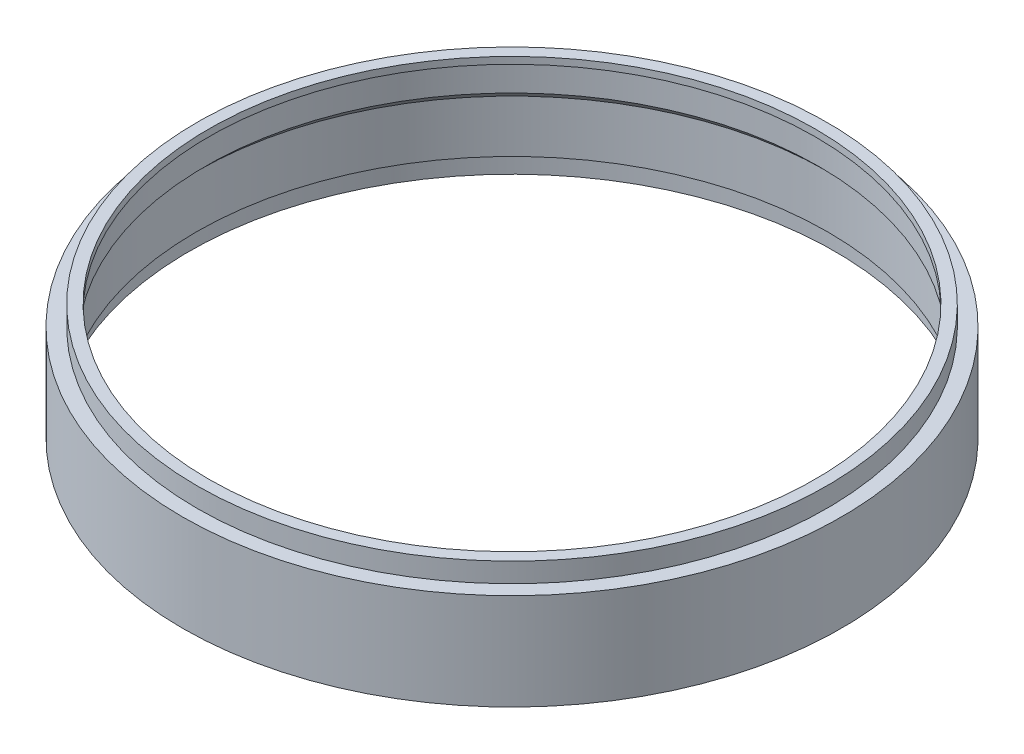
ISO-10303-21;
HEADER;
FILE_DESCRIPTION(('STEP AP214'),'2;1');
FILE_NAME('part.step','',(''),(''),'','','');
FILE_SCHEMA(('AUTOMOTIVE_DESIGN { 1 0 10303 214 1 1 1 1 }'));
ENDSEC;
DATA;
#1=APPLICATION_CONTEXT('core data for automotive mechanical design processes');
#2=APPLICATION_PROTOCOL_DEFINITION('international standard','automotive_design',2000,#1);
#3=PRODUCT_CONTEXT('',#1,'mechanical');
#4=PRODUCT('Part','Part','',(#3));
#5=PRODUCT_RELATED_PRODUCT_CATEGORY('part','',(#4));
#6=PRODUCT_DEFINITION_FORMATION('','',#4);
#7=PRODUCT_DEFINITION_CONTEXT('part definition',#1,'design');
#8=PRODUCT_DEFINITION('design','',#6,#7);
#9=PRODUCT_DEFINITION_SHAPE('','',#8);
#10=(LENGTH_UNIT() NAMED_UNIT(*) SI_UNIT(.MILLI.,.METRE.));
#11=(NAMED_UNIT(*) PLANE_ANGLE_UNIT() SI_UNIT($,.RADIAN.));
#12=(NAMED_UNIT(*) SI_UNIT($,.STERADIAN.) SOLID_ANGLE_UNIT());
#13=UNCERTAINTY_MEASURE_WITH_UNIT(LENGTH_MEASURE(1.E-05),#10,'distance_accuracy_value','');
#14=(GEOMETRIC_REPRESENTATION_CONTEXT(3) GLOBAL_UNCERTAINTY_ASSIGNED_CONTEXT((#13)) GLOBAL_UNIT_ASSIGNED_CONTEXT((#10,
#11,#12)) REPRESENTATION_CONTEXT('',''));
#15=CARTESIAN_POINT('',(0.,0.,0.));
#16=DIRECTION('',(0.,0.,1.));
#17=DIRECTION('',(1.,0.,0.));
#18=AXIS2_PLACEMENT_3D('',#15,#16,#17);
#19=CARTESIAN_POINT('',(0.,0.,0.));
#20=DIRECTION('',(0.,1.,0.));
#21=DIRECTION('',(0.,0.,1.));
#22=AXIS2_PLACEMENT_3D('',#19,#20,#21);
#23=CYLINDRICAL_SURFACE('',#22,45.);
#24=CARTESIAN_POINT('',(0.,16.0199993692233,0.));
#25=DIRECTION('',(0.,1.,0.));
#26=DIRECTION('',(0.,0.,1.));
#27=AXIS2_PLACEMENT_3D('',#24,#25,#26);
#28=CIRCLE('',#27,45.);
#29=CARTESIAN_POINT('',(0.,16.0199993692233,45.));
#30=VERTEX_POINT('',#29);
#31=EDGE_CURVE('E17',#30,#30,#28,.F.);
#32=ORIENTED_EDGE('',*,*,#31,.F.);
#33=EDGE_LOOP('',(#32));
#34=FACE_BOUND('',#33,.T.);
#35=CARTESIAN_POINT('',(0.,12.0199993692233,0.));
#36=DIRECTION('',(0.,-1.,0.));
#37=DIRECTION('',(0.,0.,-1.));
#38=AXIS2_PLACEMENT_3D('',#35,#36,#37);
#39=CIRCLE('',#38,45.);
#40=CARTESIAN_POINT('',(0.,12.0199993692233,-45.));
#41=VERTEX_POINT('',#40);
#42=EDGE_CURVE('E29',#41,#41,#39,.T.);
#43=ORIENTED_EDGE('',*,*,#42,.T.);
#44=EDGE_LOOP('',(#43));
#45=FACE_BOUND('',#44,.T.);
#46=ADVANCED_FACE('F14',(#34,#45),#23,.F.);
#47=CARTESIAN_POINT('',(0.,10.6699993692233,0.));
#48=DIRECTION('',(0.,-1.,0.));
#49=DIRECTION('',(0.,0.,-1.));
#50=AXIS2_PLACEMENT_3D('',#47,#48,#49);
#51=CONICAL_SURFACE('',#50,46.35,0.785398163397451);
#52=CARTESIAN_POINT('',(0.,10.6699993692233,0.));
#53=DIRECTION('',(0.,1.,0.));
#54=DIRECTION('',(0.,0.,1.));
#55=AXIS2_PLACEMENT_3D('',#52,#53,#54);
#56=CIRCLE('',#55,46.35);
#57=CARTESIAN_POINT('',(0.,10.6699993692233,46.35));
#58=VERTEX_POINT('',#57);
#59=EDGE_CURVE('E50',#58,#58,#56,.F.);
#60=ORIENTED_EDGE('',*,*,#59,.T.);
#61=EDGE_LOOP('',(#60));
#62=FACE_BOUND('',#61,.T.);
#63=ORIENTED_EDGE('',*,*,#42,.F.);
#64=EDGE_LOOP('',(#63));
#65=FACE_BOUND('',#64,.T.);
#66=ADVANCED_FACE('F63',(#62,#65),#51,.F.);
#67=CARTESIAN_POINT('',(-45.,16.0199993692233,0.));
#68=DIRECTION('',(0.,-1.,0.));
#69=DIRECTION('',(0.,0.,-1.));
#70=AXIS2_PLACEMENT_3D('',#67,#68,#69);
#71=PLANE('',#70);
#72=ORIENTED_EDGE('',*,*,#31,.T.);
#73=EDGE_LOOP('',(#72));
#74=FACE_BOUND('',#73,.T.);
#75=CARTESIAN_POINT('',(0.,16.0199993692233,0.));
#76=DIRECTION('',(0.,1.,0.));
#77=DIRECTION('',(0.,0.,1.));
#78=AXIS2_PLACEMENT_3D('',#75,#76,#77);
#79=CIRCLE('',#78,44.5);
#80=CARTESIAN_POINT('',(0.,16.0199993692233,44.5));
#81=VERTEX_POINT('',#80);
#82=EDGE_CURVE('E48',#81,#81,#79,.T.);
#83=ORIENTED_EDGE('',*,*,#82,.T.);
#84=EDGE_LOOP('',(#83));
#85=FACE_BOUND('',#84,.T.);
#86=ADVANCED_FACE('F65',(#74,#85),#71,.T.);
#87=CARTESIAN_POINT('',(0.,0.,0.));
#88=DIRECTION('',(0.,1.,0.));
#89=DIRECTION('',(0.,0.,1.));
#90=AXIS2_PLACEMENT_3D('',#87,#88,#89);
#91=CYLINDRICAL_SURFACE('',#90,46.35);
#92=ORIENTED_EDGE('',*,*,#59,.F.);
#93=EDGE_LOOP('',(#92));
#94=FACE_BOUND('',#93,.T.);
#95=CARTESIAN_POINT('',(0.,3.,0.));
#96=DIRECTION('',(0.,1.,0.));
#97=DIRECTION('',(0.,0.,1.));
#98=AXIS2_PLACEMENT_3D('',#95,#96,#97);
#99=CIRCLE('',#98,46.35);
#100=CARTESIAN_POINT('',(0.,3.,46.35));
#101=VERTEX_POINT('',#100);
#102=EDGE_CURVE('E46',#101,#101,#99,.T.);
#103=ORIENTED_EDGE('',*,*,#102,.F.);
#104=EDGE_LOOP('',(#103));
#105=FACE_BOUND('',#104,.T.);
#106=ADVANCED_FACE('F71',(#94,#105),#91,.F.);
#107=CARTESIAN_POINT('',(0.,0.,0.));
#108=DIRECTION('',(0.,1.,0.));
#109=DIRECTION('',(0.,0.,1.));
#110=AXIS2_PLACEMENT_3D('',#107,#108,#109);
#111=CYLINDRICAL_SURFACE('',#110,44.5);
#112=CARTESIAN_POINT('',(0.,17.0199993692233,0.));
#113=DIRECTION('',(0.,1.,0.));
#114=DIRECTION('',(0.,0.,1.));
#115=AXIS2_PLACEMENT_3D('',#112,#113,#114);
#116=CIRCLE('',#115,44.5);
#117=CARTESIAN_POINT('',(0.,17.0199993692233,44.5));
#118=VERTEX_POINT('',#117);
#119=EDGE_CURVE('E43',#118,#118,#116,.F.);
#120=ORIENTED_EDGE('',*,*,#119,.F.);
#121=EDGE_LOOP('',(#120));
#122=FACE_BOUND('',#121,.T.);
#123=ORIENTED_EDGE('',*,*,#82,.F.);
#124=EDGE_LOOP('',(#123));
#125=FACE_BOUND('',#124,.T.);
#126=ADVANCED_FACE('F104',(#122,#125),#111,.F.);
#127=CARTESIAN_POINT('',(-47.4,3.,0.));
#128=DIRECTION('',(0.,-1.,0.));
#129=DIRECTION('',(0.,0.,-1.));
#130=AXIS2_PLACEMENT_3D('',#127,#128,#129);
#131=PLANE('',#130);
#132=CARTESIAN_POINT('',(0.,3.,0.));
#133=DIRECTION('',(0.,1.,0.));
#134=DIRECTION('',(0.,0.,1.));
#135=AXIS2_PLACEMENT_3D('',#132,#133,#134);
#136=CIRCLE('',#135,47.4);
#137=CARTESIAN_POINT('',(0.,3.,47.4));
#138=VERTEX_POINT('',#137);
#139=EDGE_CURVE('E40',#138,#138,#136,.F.);
#140=ORIENTED_EDGE('',*,*,#139,.T.);
#141=EDGE_LOOP('',(#140));
#142=FACE_BOUND('',#141,.T.);
#143=ORIENTED_EDGE('',*,*,#102,.T.);
#144=EDGE_LOOP('',(#143));
#145=FACE_BOUND('',#144,.T.);
#146=ADVANCED_FACE('F100',(#142,#145),#131,.T.);
#147=CARTESIAN_POINT('',(-46.2,17.0199993692233,0.));
#148=DIRECTION('',(0.,1.,0.));
#149=DIRECTION('',(0.,0.,1.));
#150=AXIS2_PLACEMENT_3D('',#147,#148,#149);
#151=PLANE('',#150);
#152=ORIENTED_EDGE('',*,*,#119,.T.);
#153=EDGE_LOOP('',(#152));
#154=FACE_BOUND('',#153,.T.);
#155=CARTESIAN_POINT('',(0.,17.0199993692233,0.));
#156=DIRECTION('',(0.,1.,0.));
#157=DIRECTION('',(0.,0.,1.));
#158=AXIS2_PLACEMENT_3D('',#155,#156,#157);
#159=CIRCLE('',#158,46.2);
#160=CARTESIAN_POINT('',(0.,17.0199993692233,46.2));
#161=VERTEX_POINT('',#160);
#162=EDGE_CURVE('E37',#161,#161,#159,.F.);
#163=ORIENTED_EDGE('',*,*,#162,.F.);
#164=EDGE_LOOP('',(#163));
#165=FACE_BOUND('',#164,.T.);
#166=ADVANCED_FACE('F96',(#154,#165),#151,.T.);
#167=CARTESIAN_POINT('',(0.,0.,0.));
#168=DIRECTION('',(0.,1.,0.));
#169=DIRECTION('',(0.,0.,1.));
#170=AXIS2_PLACEMENT_3D('',#167,#168,#169);
#171=CYLINDRICAL_SURFACE('',#170,47.4);
#172=ORIENTED_EDGE('',*,*,#139,.F.);
#173=EDGE_LOOP('',(#172));
#174=FACE_BOUND('',#173,.T.);
#175=CARTESIAN_POINT('',(0.,0.,0.));
#176=DIRECTION('',(0.,1.,0.));
#177=DIRECTION('',(0.,0.,1.));
#178=AXIS2_PLACEMENT_3D('',#175,#176,#177);
#179=CIRCLE('',#178,47.4);
#180=CARTESIAN_POINT('',(0.,0.,47.4));
#181=VERTEX_POINT('',#180);
#182=EDGE_CURVE('E34',#181,#181,#179,.T.);
#183=ORIENTED_EDGE('',*,*,#182,.F.);
#184=EDGE_LOOP('',(#183));
#185=FACE_BOUND('',#184,.T.);
#186=ADVANCED_FACE('F92',(#174,#185),#171,.F.);
#187=CARTESIAN_POINT('',(0.,0.,0.));
#188=DIRECTION('',(0.,1.,0.));
#189=DIRECTION('',(0.,0.,1.));
#190=AXIS2_PLACEMENT_3D('',#187,#188,#189);
#191=CYLINDRICAL_SURFACE('',#190,46.2);
#192=CARTESIAN_POINT('',(0.,14.15,0.));
#193=DIRECTION('',(0.,1.,0.));
#194=DIRECTION('',(0.,0.,1.));
#195=AXIS2_PLACEMENT_3D('',#192,#193,#194);
#196=CIRCLE('',#195,46.2);
#197=CARTESIAN_POINT('',(0.,14.15,46.2));
#198=VERTEX_POINT('',#197);
#199=EDGE_CURVE('E26',#198,#198,#196,.F.);
#200=ORIENTED_EDGE('',*,*,#199,.F.);
#201=EDGE_LOOP('',(#200));
#202=FACE_BOUND('',#201,.T.);
#203=ORIENTED_EDGE('',*,*,#162,.T.);
#204=EDGE_LOOP('',(#203));
#205=FACE_BOUND('',#204,.T.);
#206=ADVANCED_FACE('F88',(#202,#205),#191,.T.);
#207=CARTESIAN_POINT('',(-48.35,0.,0.));
#208=DIRECTION('',(0.,-1.,0.));
#209=DIRECTION('',(0.,0.,-1.));
#210=AXIS2_PLACEMENT_3D('',#207,#208,#209);
#211=PLANE('',#210);
#212=CARTESIAN_POINT('',(0.,0.,0.));
#213=DIRECTION('',(0.,1.,0.));
#214=DIRECTION('',(0.,0.,1.));
#215=AXIS2_PLACEMENT_3D('',#212,#213,#214);
#216=CIRCLE('',#215,48.35);
#217=CARTESIAN_POINT('',(0.,0.,48.35));
#218=VERTEX_POINT('',#217);
#219=EDGE_CURVE('E21',#218,#218,#216,.T.);
#220=ORIENTED_EDGE('',*,*,#219,.F.);
#221=EDGE_LOOP('',(#220));
#222=FACE_BOUND('',#221,.T.);
#223=ORIENTED_EDGE('',*,*,#182,.T.);
#224=EDGE_LOOP('',(#223));
#225=FACE_BOUND('',#224,.T.);
#226=ADVANCED_FACE('F81',(#222,#225),#211,.T.);
#227=CARTESIAN_POINT('',(-46.2,14.15,0.));
#228=DIRECTION('',(0.,1.,0.));
#229=DIRECTION('',(0.,0.,1.));
#230=AXIS2_PLACEMENT_3D('',#227,#228,#229);
#231=PLANE('',#230);
#232=ORIENTED_EDGE('',*,*,#199,.T.);
#233=EDGE_LOOP('',(#232));
#234=FACE_BOUND('',#233,.T.);
#235=CARTESIAN_POINT('',(0.,14.15,0.));
#236=DIRECTION('',(0.,1.,0.));
#237=DIRECTION('',(0.,0.,1.));
#238=AXIS2_PLACEMENT_3D('',#235,#236,#237);
#239=CIRCLE('',#238,48.35);
#240=CARTESIAN_POINT('',(0.,14.15,48.35));
#241=VERTEX_POINT('',#240);
#242=EDGE_CURVE('E10',#241,#241,#239,.F.);
#243=ORIENTED_EDGE('',*,*,#242,.F.);
#244=EDGE_LOOP('',(#243));
#245=FACE_BOUND('',#244,.T.);
#246=ADVANCED_FACE('F76',(#234,#245),#231,.T.);
#247=CARTESIAN_POINT('',(0.,0.,0.));
#248=DIRECTION('',(0.,1.,0.));
#249=DIRECTION('',(0.,0.,1.));
#250=AXIS2_PLACEMENT_3D('',#247,#248,#249);
#251=CYLINDRICAL_SURFACE('',#250,48.35);
#252=ORIENTED_EDGE('',*,*,#242,.T.);
#253=EDGE_LOOP('',(#252));
#254=FACE_BOUND('',#253,.T.);
#255=ORIENTED_EDGE('',*,*,#219,.T.);
#256=EDGE_LOOP('',(#255));
#257=FACE_BOUND('',#256,.T.);
#258=ADVANCED_FACE('F74',(#254,#257),#251,.T.);
#259=CLOSED_SHELL('',(#46,#66,#86,#106,#126,#146,#166,#186,#206,#226,#246,#258));
#260=MANIFOLD_SOLID_BREP('B1',#259);
#261=ADVANCED_BREP_SHAPE_REPRESENTATION('',(#18,#260),#14);
#262=SHAPE_DEFINITION_REPRESENTATION(#9,#261);
ENDSEC;
END-ISO-10303-21;
